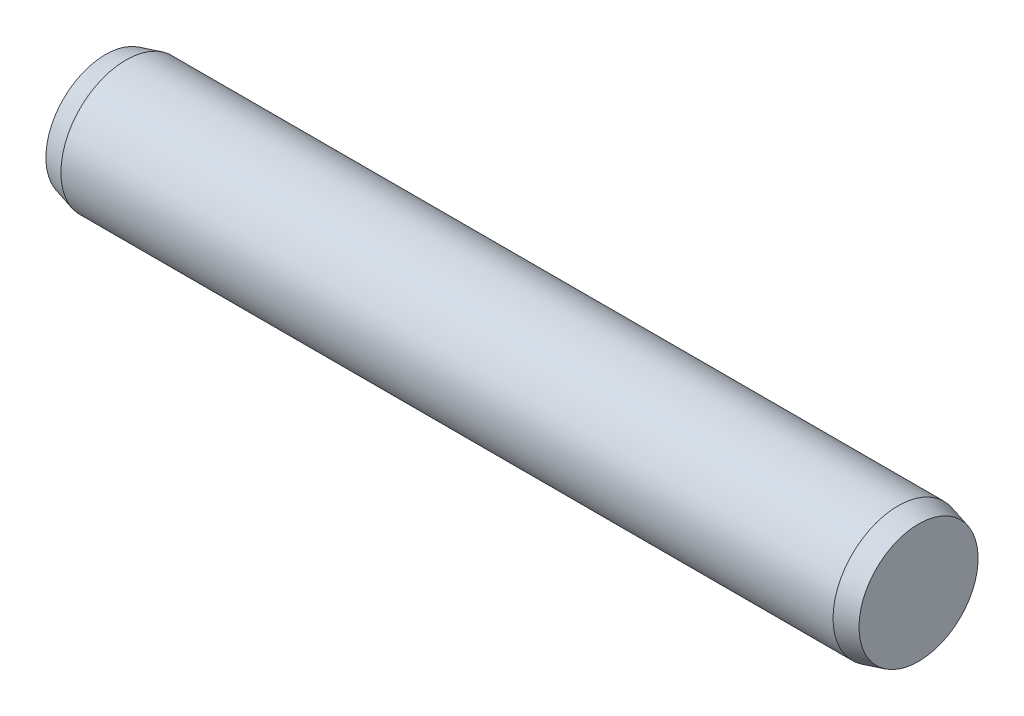
ISO-10303-21;
HEADER;
FILE_DESCRIPTION(('STEP AP214'),'2;1');
FILE_NAME('part.step','',(''),(''),'','','');
FILE_SCHEMA(('AUTOMOTIVE_DESIGN { 1 0 10303 214 1 1 1 1 }'));
ENDSEC;
DATA;
#1=APPLICATION_CONTEXT('core data for automotive mechanical design processes');
#2=APPLICATION_PROTOCOL_DEFINITION('international standard','automotive_design',2000,#1);
#3=PRODUCT_CONTEXT('',#1,'mechanical');
#4=PRODUCT('Part','Part','',(#3));
#5=PRODUCT_RELATED_PRODUCT_CATEGORY('part','',(#4));
#6=PRODUCT_DEFINITION_FORMATION('','',#4);
#7=PRODUCT_DEFINITION_CONTEXT('part definition',#1,'design');
#8=PRODUCT_DEFINITION('design','',#6,#7);
#9=PRODUCT_DEFINITION_SHAPE('','',#8);
#10=(LENGTH_UNIT() NAMED_UNIT(*) SI_UNIT(.MILLI.,.METRE.));
#11=(NAMED_UNIT(*) PLANE_ANGLE_UNIT() SI_UNIT($,.RADIAN.));
#12=(NAMED_UNIT(*) SI_UNIT($,.STERADIAN.) SOLID_ANGLE_UNIT());
#13=UNCERTAINTY_MEASURE_WITH_UNIT(LENGTH_MEASURE(1.E-05),#10,'distance_accuracy_value','');
#14=(GEOMETRIC_REPRESENTATION_CONTEXT(3) GLOBAL_UNCERTAINTY_ASSIGNED_CONTEXT((#13)) GLOBAL_UNIT_ASSIGNED_CONTEXT((#10,
#11,#12)) REPRESENTATION_CONTEXT('',''));
#15=CARTESIAN_POINT('',(0.,0.,0.));
#16=DIRECTION('',(0.,0.,1.));
#17=DIRECTION('',(1.,0.,0.));
#18=AXIS2_PLACEMENT_3D('',#15,#16,#17);
#19=CARTESIAN_POINT('',(-12.5,0.,0.));
#20=DIRECTION('',(1.,0.,0.));
#21=DIRECTION('',(0.,0.,-1.));
#22=AXIS2_PLACEMENT_3D('',#19,#20,#21);
#23=PLANE('',#22);
#24=CARTESIAN_POINT('',(-12.5,0.,0.));
#25=DIRECTION('',(1.,0.,0.));
#26=DIRECTION('',(0.,0.,-1.));
#27=AXIS2_PLACEMENT_3D('',#24,#25,#26);
#28=CIRCLE('',#27,1.83119200876839);
#29=CARTESIAN_POINT('',(-12.5,0.,-1.83119200876839));
#30=VERTEX_POINT('',#29);
#31=EDGE_CURVE('E10',#30,#30,#28,.F.);
#32=ORIENTED_EDGE('',*,*,#31,.T.);
#33=EDGE_LOOP('',(#32));
#34=FACE_BOUND('',#33,.T.);
#35=ADVANCED_FACE('F30',(#34),#23,.F.);
#36=CARTESIAN_POINT('',(0.,0.,0.));
#37=DIRECTION('',(-1.,0.,0.));
#38=DIRECTION('',(0.,0.,1.));
#39=AXIS2_PLACEMENT_3D('',#36,#37,#38);
#40=CYLINDRICAL_SURFACE('',#39,2.);
#41=CARTESIAN_POINT('',(11.87,0.,0.));
#42=DIRECTION('',(-1.,0.,0.));
#43=DIRECTION('',(0.,0.,1.));
#44=AXIS2_PLACEMENT_3D('',#41,#42,#43);
#45=CIRCLE('',#44,2.);
#46=CARTESIAN_POINT('',(11.87,0.,2.));
#47=VERTEX_POINT('',#46);
#48=EDGE_CURVE('E41',#47,#47,#45,.T.);
#49=ORIENTED_EDGE('',*,*,#48,.T.);
#50=EDGE_LOOP('',(#49));
#51=FACE_BOUND('',#50,.T.);
#52=CARTESIAN_POINT('',(-11.87,0.,0.));
#53=DIRECTION('',(1.,0.,0.));
#54=DIRECTION('',(0.,0.,-1.));
#55=AXIS2_PLACEMENT_3D('',#52,#53,#54);
#56=CIRCLE('',#55,2.);
#57=CARTESIAN_POINT('',(-11.87,0.,-2.));
#58=VERTEX_POINT('',#57);
#59=EDGE_CURVE('E45',#58,#58,#56,.T.);
#60=ORIENTED_EDGE('',*,*,#59,.T.);
#61=EDGE_LOOP('',(#60));
#62=FACE_BOUND('',#61,.T.);
#63=ADVANCED_FACE('F51',(#51,#62),#40,.T.);
#64=CARTESIAN_POINT('',(12.5,2.,0.));
#65=DIRECTION('',(-1.,0.,0.));
#66=DIRECTION('',(0.,0.,1.));
#67=AXIS2_PLACEMENT_3D('',#64,#65,#66);
#68=PLANE('',#67);
#69=CARTESIAN_POINT('',(12.5,0.,0.));
#70=DIRECTION('',(-1.,0.,0.));
#71=DIRECTION('',(0.,0.,1.));
#72=AXIS2_PLACEMENT_3D('',#69,#70,#71);
#73=CIRCLE('',#72,1.83119200876839);
#74=CARTESIAN_POINT('',(12.5,0.,1.83119200876839));
#75=VERTEX_POINT('',#74);
#76=EDGE_CURVE('E37',#75,#75,#73,.F.);
#77=ORIENTED_EDGE('',*,*,#76,.T.);
#78=EDGE_LOOP('',(#77));
#79=FACE_BOUND('',#78,.T.);
#80=ADVANCED_FACE('F59',(#79),#68,.F.);
#81=CARTESIAN_POINT('',(11.87,0.,0.));
#82=DIRECTION('',(-1.,0.,0.));
#83=DIRECTION('',(0.,0.,1.));
#84=AXIS2_PLACEMENT_3D('',#81,#82,#83);
#85=CONICAL_SURFACE('',#84,2.,0.261799387799147);
#86=ORIENTED_EDGE('',*,*,#76,.F.);
#87=EDGE_LOOP('',(#86));
#88=FACE_BOUND('',#87,.T.);
#89=ORIENTED_EDGE('',*,*,#48,.F.);
#90=EDGE_LOOP('',(#89));
#91=FACE_BOUND('',#90,.T.);
#92=ADVANCED_FACE('F55',(#88,#91),#85,.T.);
#93=CARTESIAN_POINT('',(-12.5,0.,0.));
#94=DIRECTION('',(1.,0.,0.));
#95=DIRECTION('',(0.,0.,-1.));
#96=AXIS2_PLACEMENT_3D('',#93,#94,#95);
#97=CONICAL_SURFACE('',#96,1.83119200876839,0.261799387799147);
#98=ORIENTED_EDGE('',*,*,#59,.F.);
#99=EDGE_LOOP('',(#98));
#100=FACE_BOUND('',#99,.T.);
#101=ORIENTED_EDGE('',*,*,#31,.F.);
#102=EDGE_LOOP('',(#101));
#103=FACE_BOUND('',#102,.T.);
#104=ADVANCED_FACE('F32',(#100,#103),#97,.T.);
#105=CLOSED_SHELL('',(#35,#63,#80,#92,#104));
#106=MANIFOLD_SOLID_BREP('B2',#105);
#107=ADVANCED_BREP_SHAPE_REPRESENTATION('',(#18,#106),#14);
#108=SHAPE_DEFINITION_REPRESENTATION(#9,#107);
ENDSEC;
END-ISO-10303-21;
